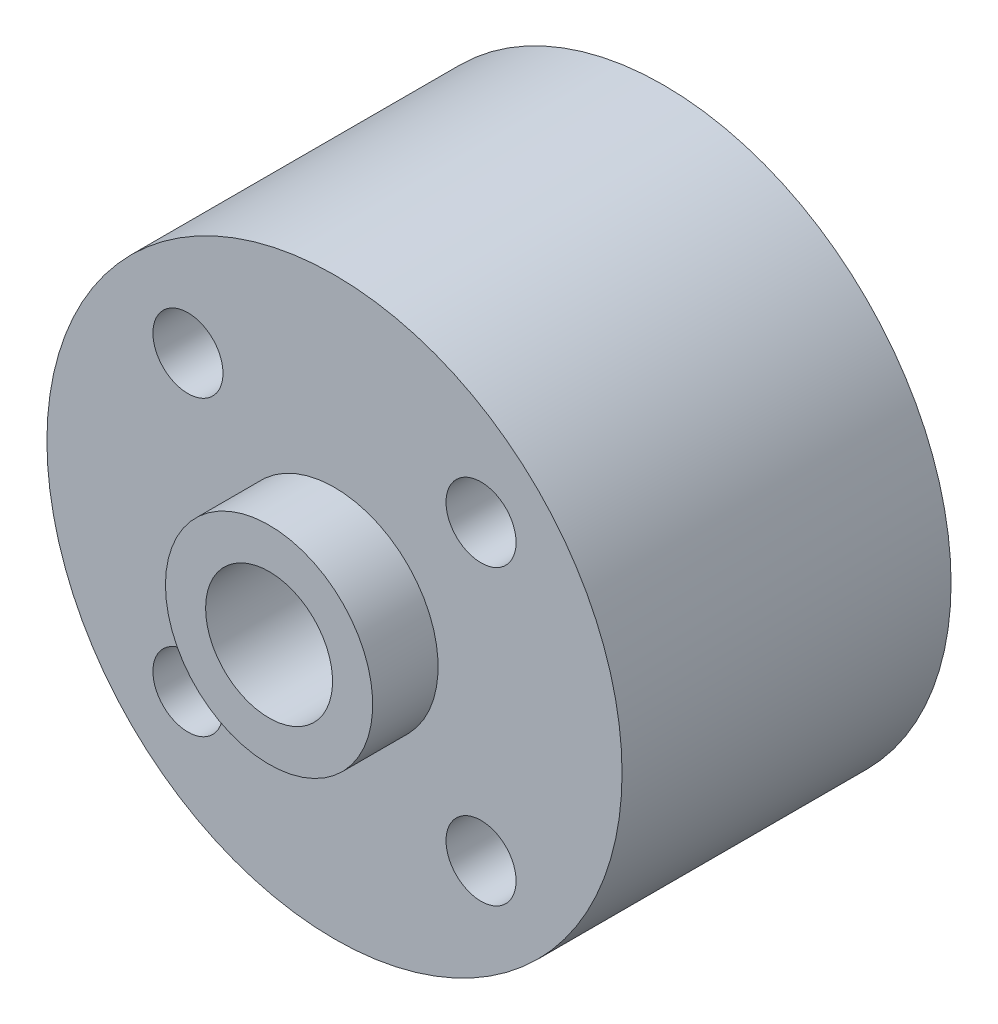
ISO-10303-21;
HEADER;
FILE_DESCRIPTION(('STEP AP214'),'2;1');
FILE_NAME('part.step','',(''),(''),'','','');
FILE_SCHEMA(('AUTOMOTIVE_DESIGN { 1 0 10303 214 1 1 1 1 }'));
ENDSEC;
DATA;
#1=APPLICATION_CONTEXT('core data for automotive mechanical design processes');
#2=APPLICATION_PROTOCOL_DEFINITION('international standard','automotive_design',2000,#1);
#3=PRODUCT_CONTEXT('',#1,'mechanical');
#4=PRODUCT('Part','Part','',(#3));
#5=PRODUCT_RELATED_PRODUCT_CATEGORY('part','',(#4));
#6=PRODUCT_DEFINITION_FORMATION('','',#4);
#7=PRODUCT_DEFINITION_CONTEXT('part definition',#1,'design');
#8=PRODUCT_DEFINITION('design','',#6,#7);
#9=PRODUCT_DEFINITION_SHAPE('','',#8);
#10=(LENGTH_UNIT() NAMED_UNIT(*) SI_UNIT(.MILLI.,.METRE.));
#11=(NAMED_UNIT(*) PLANE_ANGLE_UNIT() SI_UNIT($,.RADIAN.));
#12=(NAMED_UNIT(*) SI_UNIT($,.STERADIAN.) SOLID_ANGLE_UNIT());
#13=UNCERTAINTY_MEASURE_WITH_UNIT(LENGTH_MEASURE(1.E-05),#10,'distance_accuracy_value','');
#14=(GEOMETRIC_REPRESENTATION_CONTEXT(3) GLOBAL_UNCERTAINTY_ASSIGNED_CONTEXT((#13)) GLOBAL_UNIT_ASSIGNED_CONTEXT((#10,
#11,#12)) REPRESENTATION_CONTEXT('',''));
#15=CARTESIAN_POINT('',(0.,0.,0.));
#16=DIRECTION('',(0.,0.,1.));
#17=DIRECTION('',(1.,0.,0.));
#18=AXIS2_PLACEMENT_3D('',#15,#16,#17);
#19=CARTESIAN_POINT('',(0.,0.,6.35));
#20=DIRECTION('',(0.,0.,1.));
#21=DIRECTION('',(1.,0.,0.));
#22=AXIS2_PLACEMENT_3D('',#19,#20,#21);
#23=PLANE('',#22);
#24=CARTESIAN_POINT('',(5.656854249492,5.656854249492,6.35));
#25=DIRECTION('',(0.,0.,1.));
#26=DIRECTION('',(1.,0.,0.));
#27=AXIS2_PLACEMENT_3D('',#24,#25,#26);
#28=CIRCLE('',#27,1.35249999999999);
#29=CARTESIAN_POINT('',(7.00935424949199,5.656854249492,6.35));
#30=VERTEX_POINT('',#29);
#31=EDGE_CURVE('E135',#30,#30,#28,.T.);
#32=ORIENTED_EDGE('',*,*,#31,.F.);
#33=EDGE_LOOP('',(#32));
#34=FACE_BOUND('',#33,.T.);
#35=CARTESIAN_POINT('',(-5.656854249492,5.656854249492,6.35));
#36=DIRECTION('',(0.,0.,1.));
#37=DIRECTION('',(1.,0.,0.));
#38=AXIS2_PLACEMENT_3D('',#35,#36,#37);
#39=CIRCLE('',#38,1.35249999999999);
#40=CARTESIAN_POINT('',(-4.30435424949201,5.656854249492,6.35));
#41=VERTEX_POINT('',#40);
#42=EDGE_CURVE('E61',#41,#41,#39,.T.);
#43=ORIENTED_EDGE('',*,*,#42,.F.);
#44=EDGE_LOOP('',(#43));
#45=FACE_BOUND('',#44,.T.);
#46=CARTESIAN_POINT('',(-5.656854249492,-5.656854249492,6.35));
#47=DIRECTION('',(0.,0.,1.));
#48=DIRECTION('',(1.,0.,0.));
#49=AXIS2_PLACEMENT_3D('',#46,#47,#48);
#50=CIRCLE('',#49,1.35249999999999);
#51=CARTESIAN_POINT('',(-4.30435424949201,-5.656854249492,6.35));
#52=VERTEX_POINT('',#51);
#53=EDGE_CURVE('E49',#52,#52,#50,.T.);
#54=ORIENTED_EDGE('',*,*,#53,.F.);
#55=EDGE_LOOP('',(#54));
#56=FACE_BOUND('',#55,.T.);
#57=CARTESIAN_POINT('',(5.656854249492,-5.656854249492,6.35));
#58=DIRECTION('',(0.,0.,1.));
#59=DIRECTION('',(1.,0.,0.));
#60=AXIS2_PLACEMENT_3D('',#57,#58,#59);
#61=CIRCLE('',#60,1.35249999999999);
#62=CARTESIAN_POINT('',(7.00935424949199,-5.656854249492,6.35));
#63=VERTEX_POINT('',#62);
#64=EDGE_CURVE('E48',#63,#63,#61,.T.);
#65=ORIENTED_EDGE('',*,*,#64,.F.);
#66=EDGE_LOOP('',(#65));
#67=FACE_BOUND('',#66,.T.);
#68=CARTESIAN_POINT('',(0.,0.,6.35));
#69=DIRECTION('',(0.,0.,1.));
#70=DIRECTION('',(1.,0.,0.));
#71=AXIS2_PLACEMENT_3D('',#68,#69,#70);
#72=CIRCLE('',#71,11.1);
#73=CARTESIAN_POINT('',(11.1,0.,6.35));
#74=VERTEX_POINT('',#73);
#75=EDGE_CURVE('E38',#74,#74,#72,.T.);
#76=ORIENTED_EDGE('',*,*,#75,.T.);
#77=EDGE_LOOP('',(#76));
#78=FACE_BOUND('',#77,.T.);
#79=CARTESIAN_POINT('',(0.,0.,6.35));
#80=DIRECTION('',(0.,0.,1.));
#81=DIRECTION('',(1.,0.,0.));
#82=AXIS2_PLACEMENT_3D('',#79,#80,#81);
#83=CIRCLE('',#82,4.);
#84=CARTESIAN_POINT('',(-4.,0.,6.35));
#85=VERTEX_POINT('',#84);
#86=EDGE_CURVE('E67',#85,#85,#83,.T.);
#87=ORIENTED_EDGE('',*,*,#86,.F.);
#88=EDGE_LOOP('',(#87));
#89=FACE_BOUND('',#88,.T.);
#90=ADVANCED_FACE('F30',(#34,#45,#56,#67,#78,#89),#23,.T.);
#91=CARTESIAN_POINT('',(11.1,0.,-6.35));
#92=DIRECTION('',(0.,0.,-1.));
#93=DIRECTION('',(-1.,0.,0.));
#94=AXIS2_PLACEMENT_3D('',#91,#92,#93);
#95=PLANE('',#94);
#96=CARTESIAN_POINT('',(5.656854249492,5.656854249492,-6.35));
#97=DIRECTION('',(0.,0.,-1.));
#98=DIRECTION('',(-1.,0.,0.));
#99=AXIS2_PLACEMENT_3D('',#96,#97,#98);
#100=CIRCLE('',#99,1.35249999999999);
#101=CARTESIAN_POINT('',(4.30435424949201,5.656854249492,-6.35));
#102=VERTEX_POINT('',#101);
#103=EDGE_CURVE('E34',#102,#102,#100,.T.);
#104=ORIENTED_EDGE('',*,*,#103,.F.);
#105=EDGE_LOOP('',(#104));
#106=FACE_BOUND('',#105,.T.);
#107=CARTESIAN_POINT('',(-5.656854249492,5.656854249492,-6.35));
#108=DIRECTION('',(0.,0.,-1.));
#109=DIRECTION('',(-1.,0.,0.));
#110=AXIS2_PLACEMENT_3D('',#107,#108,#109);
#111=CIRCLE('',#110,1.35249999999999);
#112=CARTESIAN_POINT('',(-7.00935424949199,5.656854249492,-6.35));
#113=VERTEX_POINT('',#112);
#114=EDGE_CURVE('E56',#113,#113,#111,.T.);
#115=ORIENTED_EDGE('',*,*,#114,.F.);
#116=EDGE_LOOP('',(#115));
#117=FACE_BOUND('',#116,.T.);
#118=CARTESIAN_POINT('',(-5.656854249492,-5.656854249492,-6.35));
#119=DIRECTION('',(0.,0.,-1.));
#120=DIRECTION('',(-1.,0.,0.));
#121=AXIS2_PLACEMENT_3D('',#118,#119,#120);
#122=CIRCLE('',#121,1.35249999999999);
#123=CARTESIAN_POINT('',(-7.00935424949199,-5.656854249492,-6.35));
#124=VERTEX_POINT('',#123);
#125=EDGE_CURVE('E46',#124,#124,#122,.T.);
#126=ORIENTED_EDGE('',*,*,#125,.F.);
#127=EDGE_LOOP('',(#126));
#128=FACE_BOUND('',#127,.T.);
#129=CARTESIAN_POINT('',(5.656854249492,-5.656854249492,-6.35));
#130=DIRECTION('',(0.,0.,-1.));
#131=DIRECTION('',(-1.,0.,0.));
#132=AXIS2_PLACEMENT_3D('',#129,#130,#131);
#133=CIRCLE('',#132,1.35249999999999);
#134=CARTESIAN_POINT('',(4.30435424949201,-5.656854249492,-6.35));
#135=VERTEX_POINT('',#134);
#136=EDGE_CURVE('E53',#135,#135,#133,.T.);
#137=ORIENTED_EDGE('',*,*,#136,.F.);
#138=EDGE_LOOP('',(#137));
#139=FACE_BOUND('',#138,.T.);
#140=CARTESIAN_POINT('',(0.,0.,-6.35));
#141=DIRECTION('',(0.,0.,1.));
#142=DIRECTION('',(1.,0.,0.));
#143=AXIS2_PLACEMENT_3D('',#140,#141,#142);
#144=CIRCLE('',#143,11.1);
#145=CARTESIAN_POINT('',(11.1,0.,-6.35));
#146=VERTEX_POINT('',#145);
#147=EDGE_CURVE('E10',#146,#146,#144,.T.);
#148=ORIENTED_EDGE('',*,*,#147,.F.);
#149=EDGE_LOOP('',(#148));
#150=FACE_BOUND('',#149,.T.);
#151=CARTESIAN_POINT('',(0.,0.,-6.35));
#152=DIRECTION('',(0.,0.,-1.));
#153=DIRECTION('',(-1.,0.,0.));
#154=AXIS2_PLACEMENT_3D('',#151,#152,#153);
#155=CIRCLE('',#154,4.);
#156=CARTESIAN_POINT('',(4.,0.,-6.35));
#157=VERTEX_POINT('',#156);
#158=EDGE_CURVE('E71',#157,#157,#155,.T.);
#159=ORIENTED_EDGE('',*,*,#158,.F.);
#160=EDGE_LOOP('',(#159));
#161=FACE_BOUND('',#160,.T.);
#162=ADVANCED_FACE('F80',(#106,#117,#128,#139,#150,#161),#95,.T.);
#163=CARTESIAN_POINT('',(0.,0.,-6.35));
#164=DIRECTION('',(0.,0.,1.));
#165=DIRECTION('',(1.,0.,0.));
#166=AXIS2_PLACEMENT_3D('',#163,#164,#165);
#167=CYLINDRICAL_SURFACE('',#166,11.1);
#168=ORIENTED_EDGE('',*,*,#147,.T.);
#169=EDGE_LOOP('',(#168));
#170=FACE_BOUND('',#169,.T.);
#171=ORIENTED_EDGE('',*,*,#75,.F.);
#172=EDGE_LOOP('',(#171));
#173=FACE_BOUND('',#172,.T.);
#174=ADVANCED_FACE('F32',(#170,#173),#167,.T.);
#175=CARTESIAN_POINT('',(0.,0.,-8.875));
#176=DIRECTION('',(0.,0.,1.));
#177=DIRECTION('',(1.,0.,0.));
#178=AXIS2_PLACEMENT_3D('',#175,#176,#177);
#179=CYLINDRICAL_SURFACE('',#178,4.);
#180=CARTESIAN_POINT('',(0.,0.,-8.875));
#181=DIRECTION('',(0.,0.,-1.));
#182=DIRECTION('',(-1.,0.,0.));
#183=AXIS2_PLACEMENT_3D('',#180,#181,#182);
#184=CIRCLE('',#183,4.);
#185=CARTESIAN_POINT('',(4.,0.,-8.875));
#186=VERTEX_POINT('',#185);
#187=EDGE_CURVE('E43',#186,#186,#184,.T.);
#188=CARTESIAN_POINT('',(4.,0.,-8.875));
#189=CARTESIAN_POINT('',(4.,0.,-8.84869791666667));
#190=CARTESIAN_POINT('',(4.,0.,-8.82239583333333));
#191=CARTESIAN_POINT('',(4.,0.,-8.76979166666666));
#192=CARTESIAN_POINT('',(4.,0.,-8.74348958333333));
#193=CARTESIAN_POINT('',(4.,0.,-8.69088541666667));
#194=CARTESIAN_POINT('',(4.,0.,-8.66458333333333));
#195=CARTESIAN_POINT('',(4.,0.,-8.61197916666667));
#196=CARTESIAN_POINT('',(4.,0.,-8.58567708333333));
#197=CARTESIAN_POINT('',(4.,0.,-8.53307291666667));
#198=CARTESIAN_POINT('',(4.,0.,-8.50677083333333));
#199=CARTESIAN_POINT('',(4.,0.,-8.45416666666667));
#200=CARTESIAN_POINT('',(4.,0.,-8.42786458333333));
#201=CARTESIAN_POINT('',(4.,0.,-8.37526041666666));
#202=CARTESIAN_POINT('',(4.,0.,-8.34895833333333));
#203=CARTESIAN_POINT('',(4.,0.,-8.29635416666667));
#204=CARTESIAN_POINT('',(4.,0.,-8.27005208333333));
#205=CARTESIAN_POINT('',(4.,0.,-8.21744791666667));
#206=CARTESIAN_POINT('',(4.,0.,-8.19114583333333));
#207=CARTESIAN_POINT('',(4.,0.,-8.13854166666667));
#208=CARTESIAN_POINT('',(4.,0.,-8.11223958333333));
#209=CARTESIAN_POINT('',(4.,0.,-8.05963541666667));
#210=CARTESIAN_POINT('',(4.,0.,-8.03333333333333));
#211=CARTESIAN_POINT('',(4.,0.,-7.98072916666667));
#212=CARTESIAN_POINT('',(4.,0.,-7.95442708333333));
#213=CARTESIAN_POINT('',(4.,0.,-7.90182291666667));
#214=CARTESIAN_POINT('',(4.,0.,-7.87552083333333));
#215=CARTESIAN_POINT('',(4.,0.,-7.82291666666667));
#216=CARTESIAN_POINT('',(4.,0.,-7.79661458333333));
#217=CARTESIAN_POINT('',(4.,0.,-7.74401041666667));
#218=CARTESIAN_POINT('',(4.,0.,-7.71770833333333));
#219=CARTESIAN_POINT('',(4.,0.,-7.66510416666667));
#220=CARTESIAN_POINT('',(4.,0.,-7.63880208333333));
#221=CARTESIAN_POINT('',(4.,0.,-7.58619791666667));
#222=CARTESIAN_POINT('',(4.,0.,-7.55989583333333));
#223=CARTESIAN_POINT('',(4.,0.,-7.50729166666667));
#224=CARTESIAN_POINT('',(4.,0.,-7.48098958333333));
#225=CARTESIAN_POINT('',(4.,0.,-7.42838541666667));
#226=CARTESIAN_POINT('',(4.,0.,-7.40208333333333));
#227=CARTESIAN_POINT('',(4.,0.,-7.34947916666667));
#228=CARTESIAN_POINT('',(4.,0.,-7.32317708333333));
#229=CARTESIAN_POINT('',(4.,0.,-7.27057291666667));
#230=CARTESIAN_POINT('',(4.,0.,-7.24427083333333));
#231=CARTESIAN_POINT('',(4.,0.,-7.19166666666667));
#232=CARTESIAN_POINT('',(4.,0.,-7.16536458333333));
#233=CARTESIAN_POINT('',(4.,0.,-7.11276041666667));
#234=CARTESIAN_POINT('',(4.,0.,-7.08645833333333));
#235=CARTESIAN_POINT('',(4.,0.,-7.03385416666667));
#236=CARTESIAN_POINT('',(4.,0.,-7.00755208333333));
#237=CARTESIAN_POINT('',(4.,0.,-6.95494791666667));
#238=CARTESIAN_POINT('',(4.,0.,-6.92864583333333));
#239=CARTESIAN_POINT('',(4.,0.,-6.87604166666667));
#240=CARTESIAN_POINT('',(4.,0.,-6.84973958333333));
#241=CARTESIAN_POINT('',(4.,0.,-6.79713541666667));
#242=CARTESIAN_POINT('',(4.,0.,-6.77083333333333));
#243=CARTESIAN_POINT('',(4.,0.,-6.71822916666667));
#244=CARTESIAN_POINT('',(4.,0.,-6.69192708333333));
#245=CARTESIAN_POINT('',(4.,0.,-6.63932291666667));
#246=CARTESIAN_POINT('',(4.,0.,-6.61302083333333));
#247=CARTESIAN_POINT('',(4.,0.,-6.56041666666667));
#248=CARTESIAN_POINT('',(4.,0.,-6.53411458333333));
#249=CARTESIAN_POINT('',(4.,0.,-6.48151041666667));
#250=CARTESIAN_POINT('',(4.,0.,-6.45520833333333));
#251=CARTESIAN_POINT('',(4.,0.,-6.40260416666667));
#252=CARTESIAN_POINT('',(4.,0.,-6.37630208333333));
#253=CARTESIAN_POINT('',(4.,0.,-6.35));
#254=B_SPLINE_CURVE_WITH_KNOTS('',3,(#188,#189,#190,#191,#192,#193,#194,#195,#196,#197,#198,
#199,#200,#201,#202,#203,#204,#205,#206,#207,#208,#209,#210,#211,#212,#213,#214,#215,#216,#217,
#218,#219,#220,#221,#222,#223,#224,#225,#226,#227,#228,#229,#230,#231,#232,#233,#234,#235,#236,
#237,#238,#239,#240,#241,#242,#243,#244,#245,#246,#247,#248,#249,#250,#251,#252,#253),
.UNSPECIFIED.,.F.,.F.,(4,2,2,2,2,2,2,2,2,2,2,2,2,2,2,2,2,2,2,2,2,2,2,2,2,2,2,2,2,2,2,2,4),(0.,
0.0789062500000017,0.157812500000002,0.236718750000002,0.315625000000002,0.394531250000002,
0.473437500000002,0.552343750000002,0.631250000000002,0.710156250000002,0.789062500000002,
0.867968750000002,0.946875000000002,1.02578125,1.1046875,1.18359375,1.2625,1.34140625,1.4203125,
1.49921875,1.578125,1.65703125,1.7359375,1.81484375,1.89375,1.97265625,2.0515625,2.13046875,
2.209375,2.28828125,2.3671875,2.44609375,2.525),.UNSPECIFIED.);
#255=EDGE_CURVE('BSEAM78',#186,#157,#254,.T.);
#256=ORIENTED_EDGE('',*,*,#187,.F.);
#257=ORIENTED_EDGE('',*,*,#158,.T.);
#258=ORIENTED_EDGE('',*,*,#255,.T.);
#259=ORIENTED_EDGE('',*,*,#255,.F.);
#260=EDGE_LOOP('',(#256,#258,#257,#259));
#261=FACE_BOUND('',#260,.T.);
#262=ADVANCED_FACE('F78',(#261),#179,.T.);
#263=CARTESIAN_POINT('',(0.,0.,-8.875));
#264=DIRECTION('',(0.,0.,-1.));
#265=DIRECTION('',(-1.,0.,0.));
#266=AXIS2_PLACEMENT_3D('',#263,#264,#265);
#267=PLANE('',#266);
#268=CARTESIAN_POINT('',(0.,0.,-8.875));
#269=DIRECTION('',(0.,0.,-1.));
#270=DIRECTION('',(-1.,0.,0.));
#271=AXIS2_PLACEMENT_3D('',#268,#269,#270);
#272=CIRCLE('',#271,2.44999999999999);
#273=CARTESIAN_POINT('',(-2.44999999999999,0.,-8.875));
#274=VERTEX_POINT('',#273);
#275=EDGE_CURVE('E133',#274,#274,#272,.T.);
#276=ORIENTED_EDGE('',*,*,#275,.F.);
#277=EDGE_LOOP('',(#276));
#278=FACE_BOUND('',#277,.T.);
#279=ORIENTED_EDGE('',*,*,#187,.T.);
#280=EDGE_LOOP('',(#279));
#281=FACE_BOUND('',#280,.T.);
#282=ADVANCED_FACE('F94',(#278,#281),#267,.T.);
#283=CARTESIAN_POINT('',(0.,0.,8.875));
#284=DIRECTION('',(0.,0.,-1.));
#285=DIRECTION('',(-1.,0.,0.));
#286=AXIS2_PLACEMENT_3D('',#283,#284,#285);
#287=CYLINDRICAL_SURFACE('',#286,4.);
#288=CARTESIAN_POINT('',(0.,0.,8.875));
#289=DIRECTION('',(0.,0.,1.));
#290=DIRECTION('',(1.,0.,0.));
#291=AXIS2_PLACEMENT_3D('',#288,#289,#290);
#292=CIRCLE('',#291,4.);
#293=CARTESIAN_POINT('',(-4.,0.,8.875));
#294=VERTEX_POINT('',#293);
#295=EDGE_CURVE('E68',#294,#294,#292,.T.);
#296=CARTESIAN_POINT('',(-4.,0.,8.875));
#297=CARTESIAN_POINT('',(-4.,0.,8.84869791666667));
#298=CARTESIAN_POINT('',(-4.,0.,8.82239583333333));
#299=CARTESIAN_POINT('',(-4.,0.,8.76979166666666));
#300=CARTESIAN_POINT('',(-4.,0.,8.74348958333333));
#301=CARTESIAN_POINT('',(-4.,0.,8.69088541666667));
#302=CARTESIAN_POINT('',(-4.,0.,8.66458333333333));
#303=CARTESIAN_POINT('',(-4.,0.,8.61197916666667));
#304=CARTESIAN_POINT('',(-4.,0.,8.58567708333333));
#305=CARTESIAN_POINT('',(-4.,0.,8.53307291666667));
#306=CARTESIAN_POINT('',(-4.,0.,8.50677083333333));
#307=CARTESIAN_POINT('',(-4.,0.,8.45416666666667));
#308=CARTESIAN_POINT('',(-4.,0.,8.42786458333333));
#309=CARTESIAN_POINT('',(-4.,0.,8.37526041666666));
#310=CARTESIAN_POINT('',(-4.,0.,8.34895833333333));
#311=CARTESIAN_POINT('',(-4.,0.,8.29635416666667));
#312=CARTESIAN_POINT('',(-4.,0.,8.27005208333333));
#313=CARTESIAN_POINT('',(-4.,0.,8.21744791666667));
#314=CARTESIAN_POINT('',(-4.,0.,8.19114583333333));
#315=CARTESIAN_POINT('',(-4.,0.,8.13854166666667));
#316=CARTESIAN_POINT('',(-4.,0.,8.11223958333333));
#317=CARTESIAN_POINT('',(-4.,0.,8.05963541666667));
#318=CARTESIAN_POINT('',(-4.,0.,8.03333333333333));
#319=CARTESIAN_POINT('',(-4.,0.,7.98072916666667));
#320=CARTESIAN_POINT('',(-4.,0.,7.95442708333333));
#321=CARTESIAN_POINT('',(-4.,0.,7.90182291666667));
#322=CARTESIAN_POINT('',(-4.,0.,7.87552083333333));
#323=CARTESIAN_POINT('',(-4.,0.,7.82291666666667));
#324=CARTESIAN_POINT('',(-4.,0.,7.79661458333333));
#325=CARTESIAN_POINT('',(-4.,0.,7.74401041666667));
#326=CARTESIAN_POINT('',(-4.,0.,7.71770833333333));
#327=CARTESIAN_POINT('',(-4.,0.,7.66510416666667));
#328=CARTESIAN_POINT('',(-4.,0.,7.63880208333333));
#329=CARTESIAN_POINT('',(-4.,0.,7.58619791666667));
#330=CARTESIAN_POINT('',(-4.,0.,7.55989583333333));
#331=CARTESIAN_POINT('',(-4.,0.,7.50729166666667));
#332=CARTESIAN_POINT('',(-4.,0.,7.48098958333333));
#333=CARTESIAN_POINT('',(-4.,0.,7.42838541666667));
#334=CARTESIAN_POINT('',(-4.,0.,7.40208333333333));
#335=CARTESIAN_POINT('',(-4.,0.,7.34947916666667));
#336=CARTESIAN_POINT('',(-4.,0.,7.32317708333333));
#337=CARTESIAN_POINT('',(-4.,0.,7.27057291666667));
#338=CARTESIAN_POINT('',(-4.,0.,7.24427083333333));
#339=CARTESIAN_POINT('',(-4.,0.,7.19166666666667));
#340=CARTESIAN_POINT('',(-4.,0.,7.16536458333333));
#341=CARTESIAN_POINT('',(-4.,0.,7.11276041666667));
#342=CARTESIAN_POINT('',(-4.,0.,7.08645833333333));
#343=CARTESIAN_POINT('',(-4.,0.,7.03385416666667));
#344=CARTESIAN_POINT('',(-4.,0.,7.00755208333333));
#345=CARTESIAN_POINT('',(-4.,0.,6.95494791666667));
#346=CARTESIAN_POINT('',(-4.,0.,6.92864583333333));
#347=CARTESIAN_POINT('',(-4.,0.,6.87604166666667));
#348=CARTESIAN_POINT('',(-4.,0.,6.84973958333333));
#349=CARTESIAN_POINT('',(-4.,0.,6.79713541666667));
#350=CARTESIAN_POINT('',(-4.,0.,6.77083333333333));
#351=CARTESIAN_POINT('',(-4.,0.,6.71822916666667));
#352=CARTESIAN_POINT('',(-4.,0.,6.69192708333333));
#353=CARTESIAN_POINT('',(-4.,0.,6.63932291666667));
#354=CARTESIAN_POINT('',(-4.,0.,6.61302083333333));
#355=CARTESIAN_POINT('',(-4.,0.,6.56041666666667));
#356=CARTESIAN_POINT('',(-4.,0.,6.53411458333333));
#357=CARTESIAN_POINT('',(-4.,0.,6.48151041666667));
#358=CARTESIAN_POINT('',(-4.,0.,6.45520833333333));
#359=CARTESIAN_POINT('',(-4.,0.,6.40260416666667));
#360=CARTESIAN_POINT('',(-4.,0.,6.37630208333333));
#361=CARTESIAN_POINT('',(-4.,0.,6.35));
#362=B_SPLINE_CURVE_WITH_KNOTS('',3,(#296,#297,#298,#299,#300,#301,#302,#303,#304,#305,#306,
#307,#308,#309,#310,#311,#312,#313,#314,#315,#316,#317,#318,#319,#320,#321,#322,#323,#324,#325,
#326,#327,#328,#329,#330,#331,#332,#333,#334,#335,#336,#337,#338,#339,#340,#341,#342,#343,#344,
#345,#346,#347,#348,#349,#350,#351,#352,#353,#354,#355,#356,#357,#358,#359,#360,#361),
.UNSPECIFIED.,.F.,.F.,(4,2,2,2,2,2,2,2,2,2,2,2,2,2,2,2,2,2,2,2,2,2,2,2,2,2,2,2,2,2,2,2,4),(0.,
0.0789062500000017,0.157812500000002,0.236718750000002,0.315625000000002,0.394531250000002,
0.473437500000002,0.552343750000002,0.631250000000002,0.710156250000002,0.789062500000002,
0.867968750000002,0.946875000000002,1.02578125,1.1046875,1.18359375,1.2625,1.34140625,1.4203125,
1.49921875,1.578125,1.65703125,1.7359375,1.81484375,1.89375,1.97265625,2.0515625,2.13046875,
2.209375,2.28828125,2.3671875,2.44609375,2.525),.UNSPECIFIED.);
#363=EDGE_CURVE('BSEAM98',#294,#85,#362,.T.);
#364=ORIENTED_EDGE('',*,*,#295,.F.);
#365=ORIENTED_EDGE('',*,*,#86,.T.);
#366=ORIENTED_EDGE('',*,*,#363,.T.);
#367=ORIENTED_EDGE('',*,*,#363,.F.);
#368=EDGE_LOOP('',(#364,#366,#365,#367));
#369=FACE_BOUND('',#368,.T.);
#370=ADVANCED_FACE('F98',(#369),#287,.T.);
#371=CARTESIAN_POINT('',(0.,0.,8.875));
#372=DIRECTION('',(0.,0.,1.));
#373=DIRECTION('',(1.,0.,0.));
#374=AXIS2_PLACEMENT_3D('',#371,#372,#373);
#375=PLANE('',#374);
#376=CARTESIAN_POINT('',(0.,0.,8.875));
#377=DIRECTION('',(0.,0.,-1.));
#378=DIRECTION('',(-1.,0.,0.));
#379=AXIS2_PLACEMENT_3D('',#376,#377,#378);
#380=CIRCLE('',#379,2.44999999999999);
#381=CARTESIAN_POINT('',(-2.44999999999999,0.,8.875));
#382=VERTEX_POINT('',#381);
#383=EDGE_CURVE('E130',#382,#382,#380,.T.);
#384=ORIENTED_EDGE('',*,*,#383,.T.);
#385=EDGE_LOOP('',(#384));
#386=FACE_BOUND('',#385,.T.);
#387=ORIENTED_EDGE('',*,*,#295,.T.);
#388=EDGE_LOOP('',(#387));
#389=FACE_BOUND('',#388,.T.);
#390=ADVANCED_FACE('F102',(#386,#389),#375,.T.);
#391=CARTESIAN_POINT('',(5.656854249492,-5.656854249492,6.35));
#392=DIRECTION('',(0.,0.,1.));
#393=DIRECTION('',(1.,0.,0.));
#394=AXIS2_PLACEMENT_3D('',#391,#392,#393);
#395=CYLINDRICAL_SURFACE('',#394,1.35249999999999);
#396=ORIENTED_EDGE('',*,*,#136,.T.);
#397=EDGE_LOOP('',(#396));
#398=FACE_BOUND('',#397,.T.);
#399=ORIENTED_EDGE('',*,*,#64,.T.);
#400=EDGE_LOOP('',(#399));
#401=FACE_BOUND('',#400,.T.);
#402=ADVANCED_FACE('F106',(#398,#401),#395,.F.);
#403=CARTESIAN_POINT('',(-5.656854249492,-5.656854249492,6.35));
#404=DIRECTION('',(0.,0.,1.));
#405=DIRECTION('',(1.,0.,0.));
#406=AXIS2_PLACEMENT_3D('',#403,#404,#405);
#407=CYLINDRICAL_SURFACE('',#406,1.35249999999999);
#408=ORIENTED_EDGE('',*,*,#125,.T.);
#409=EDGE_LOOP('',(#408));
#410=FACE_BOUND('',#409,.T.);
#411=ORIENTED_EDGE('',*,*,#53,.T.);
#412=EDGE_LOOP('',(#411));
#413=FACE_BOUND('',#412,.T.);
#414=ADVANCED_FACE('F110',(#410,#413),#407,.F.);
#415=CARTESIAN_POINT('',(-5.656854249492,5.656854249492,6.35));
#416=DIRECTION('',(0.,0.,1.));
#417=DIRECTION('',(1.,0.,0.));
#418=AXIS2_PLACEMENT_3D('',#415,#416,#417);
#419=CYLINDRICAL_SURFACE('',#418,1.35249999999999);
#420=ORIENTED_EDGE('',*,*,#114,.T.);
#421=EDGE_LOOP('',(#420));
#422=FACE_BOUND('',#421,.T.);
#423=ORIENTED_EDGE('',*,*,#42,.T.);
#424=EDGE_LOOP('',(#423));
#425=FACE_BOUND('',#424,.T.);
#426=ADVANCED_FACE('F114',(#422,#425),#419,.F.);
#427=CARTESIAN_POINT('',(5.656854249492,5.656854249492,6.35));
#428=DIRECTION('',(0.,0.,1.));
#429=DIRECTION('',(1.,0.,0.));
#430=AXIS2_PLACEMENT_3D('',#427,#428,#429);
#431=CYLINDRICAL_SURFACE('',#430,1.35249999999999);
#432=ORIENTED_EDGE('',*,*,#103,.T.);
#433=EDGE_LOOP('',(#432));
#434=FACE_BOUND('',#433,.T.);
#435=ORIENTED_EDGE('',*,*,#31,.T.);
#436=EDGE_LOOP('',(#435));
#437=FACE_BOUND('',#436,.T.);
#438=ADVANCED_FACE('F117',(#434,#437),#431,.F.);
#439=CARTESIAN_POINT('',(0.,0.,-8.875));
#440=DIRECTION('',(0.,0.,-1.));
#441=DIRECTION('',(-1.,0.,0.));
#442=AXIS2_PLACEMENT_3D('',#439,#440,#441);
#443=CYLINDRICAL_SURFACE('',#442,2.44999999999999);
#444=ORIENTED_EDGE('',*,*,#383,.F.);
#445=EDGE_LOOP('',(#444));
#446=FACE_BOUND('',#445,.T.);
#447=ORIENTED_EDGE('',*,*,#275,.T.);
#448=EDGE_LOOP('',(#447));
#449=FACE_BOUND('',#448,.T.);
#450=ADVANCED_FACE('F121',(#446,#449),#443,.F.);
#451=CLOSED_SHELL('',(#90,#162,#174,#262,#282,#370,#390,#402,#414,#426,#438,#450));
#452=MANIFOLD_SOLID_BREP('B2',#451);
#453=ADVANCED_BREP_SHAPE_REPRESENTATION('',(#18,#452),#14);
#454=SHAPE_DEFINITION_REPRESENTATION(#9,#453);
ENDSEC;
END-ISO-10303-21;
